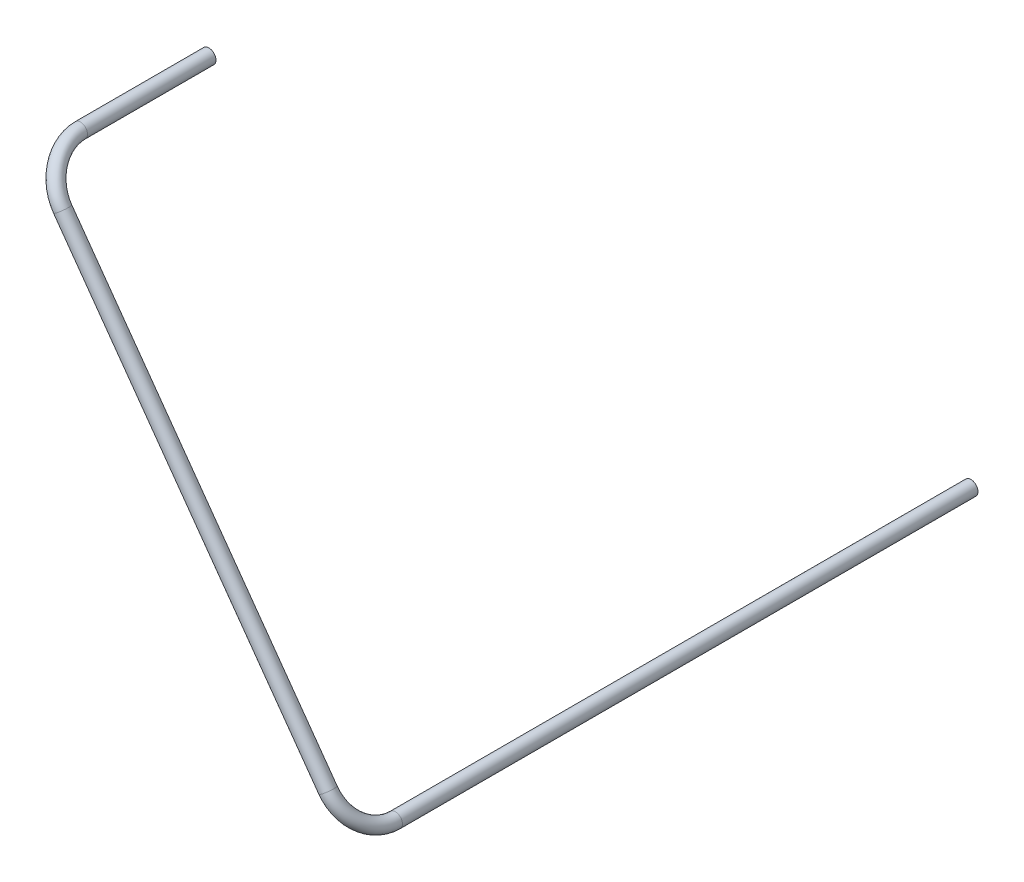
ISO-10303-21;
HEADER;
FILE_DESCRIPTION(('STEP AP214'),'2;1');
FILE_NAME('part.step','',(''),(''),'','','');
FILE_SCHEMA(('AUTOMOTIVE_DESIGN { 1 0 10303 214 1 1 1 1 }'));
ENDSEC;
DATA;
#1=APPLICATION_CONTEXT('core data for automotive mechanical design processes');
#2=APPLICATION_PROTOCOL_DEFINITION('international standard','automotive_design',2000,#1);
#3=PRODUCT_CONTEXT('',#1,'mechanical');
#4=PRODUCT('Part','Part','',(#3));
#5=PRODUCT_RELATED_PRODUCT_CATEGORY('part','',(#4));
#6=PRODUCT_DEFINITION_FORMATION('','',#4);
#7=PRODUCT_DEFINITION_CONTEXT('part definition',#1,'design');
#8=PRODUCT_DEFINITION('design','',#6,#7);
#9=PRODUCT_DEFINITION_SHAPE('','',#8);
#10=(LENGTH_UNIT() NAMED_UNIT(*) SI_UNIT(.MILLI.,.METRE.));
#11=(NAMED_UNIT(*) PLANE_ANGLE_UNIT() SI_UNIT($,.RADIAN.));
#12=(NAMED_UNIT(*) SI_UNIT($,.STERADIAN.) SOLID_ANGLE_UNIT());
#13=UNCERTAINTY_MEASURE_WITH_UNIT(LENGTH_MEASURE(1.E-05),#10,'distance_accuracy_value','');
#14=(GEOMETRIC_REPRESENTATION_CONTEXT(3) GLOBAL_UNCERTAINTY_ASSIGNED_CONTEXT((#13)) GLOBAL_UNIT_ASSIGNED_CONTEXT((#10,
#11,#12)) REPRESENTATION_CONTEXT('',''));
#15=CARTESIAN_POINT('',(0.,0.,0.));
#16=DIRECTION('',(0.,0.,1.));
#17=DIRECTION('',(1.,0.,0.));
#18=AXIS2_PLACEMENT_3D('',#15,#16,#17);
#19=CARTESIAN_POINT('',(282.010871305788,-393.82561051938,115.002872571887));
#20=DIRECTION('',(0.,0.,-1.));
#21=DIRECTION('',(-1.,0.,0.));
#22=AXIS2_PLACEMENT_3D('',#19,#20,#21);
#23=CYLINDRICAL_SURFACE('',#22,6.35);
#24=CARTESIAN_POINT('',(282.010871305788,-393.82561051938,115.002872571887));
#25=DIRECTION('',(0.,0.,-1.));
#26=DIRECTION('',(0.322076822253796,0.946713536697822,0.));
#27=AXIS2_PLACEMENT_3D('',#24,#25,#26);
#28=CIRCLE('',#27,6.35);
#29=CARTESIAN_POINT('',(285.707867203451,-398.988431582777,115.002872571887));
#30=VERTEX_POINT('',#29);
#31=EDGE_CURVE('E37',#30,#30,#28,.T.);
#32=ORIENTED_EDGE('',*,*,#31,.T.);
#33=EDGE_LOOP('',(#32));
#34=FACE_BOUND('',#33,.T.);
#35=CARTESIAN_POINT('',(282.010871305789,-393.825610519379,-400.347253912724));
#36=DIRECTION('',(0.,0.,-1.));
#37=DIRECTION('',(0.322076822253796,0.946713536697822,0.));
#38=AXIS2_PLACEMENT_3D('',#35,#36,#37);
#39=CIRCLE('',#38,6.35);
#40=CARTESIAN_POINT('',(284.056059127101,-387.813979561348,-400.347253912724));
#41=VERTEX_POINT('',#40);
#42=EDGE_CURVE('E10',#41,#41,#39,.T.);
#43=ORIENTED_EDGE('',*,*,#42,.F.);
#44=EDGE_LOOP('',(#43));
#45=FACE_BOUND('',#44,.T.);
#46=ADVANCED_FACE('F31',(#34,#45),#23,.T.);
#47=CARTESIAN_POINT('',(259.828895919812,-362.848684138993,115.002872571887));
#48=DIRECTION('',(0.813042687149265,0.582204078372097,0.));
#49=DIRECTION('',(-0.582204078372097,0.813042687149265,0.));
#50=AXIS2_PLACEMENT_3D('',#47,#48,#49);
#51=TOROIDAL_SURFACE('',#50,38.1,6.35);
#52=CARTESIAN_POINT('',(259.828895919812,-362.848684138993,153.102872571887));
#53=DIRECTION('',(0.582204078372097,-0.813042687149264,0.));
#54=DIRECTION('',(0.661038411126897,0.473356768348913,-0.582204078372096));
#55=AXIS2_PLACEMENT_3D('',#52,#53,#54);
#56=CIRCLE('',#55,6.35);
#57=CARTESIAN_POINT('',(259.828895919812,-362.848684138993,159.452872571887));
#58=VERTEX_POINT('',#57);
#59=EDGE_CURVE('E41',#58,#58,#56,.T.);
#60=CARTESIAN_POINT('',(259.828895919812,-362.848684138993,115.002872571887));
#61=DIRECTION('',(0.813042687149265,0.582204078372097,0.));
#62=DIRECTION('',(-0.582204078372097,0.813042687149265,0.));
#63=AXIS2_PLACEMENT_3D('',#60,#61,#62);
#64=CIRCLE('',#63,44.45);
#65=EDGE_CURVE('',#58,#30,#64,.T.);
#66=ORIENTED_EDGE('',*,*,#59,.T.);
#67=ORIENTED_EDGE('',*,*,#31,.F.);
#68=ORIENTED_EDGE('',*,*,#65,.T.);
#69=ORIENTED_EDGE('',*,*,#65,.F.);
#70=EDGE_LOOP('',(#66,#68,#67,#69));
#71=FACE_BOUND('',#70,.T.);
#72=ADVANCED_FACE('F99',(#71),#51,.T.);
#73=CARTESIAN_POINT('',(22.1819753859769,-30.9769263803869,153.102872571887));
#74=DIRECTION('',(0.582204078372096,-0.813042687149265,0.));
#75=DIRECTION('',(0.813042687149265,0.582204078372096,0.));
#76=AXIS2_PLACEMENT_3D('',#73,#74,#75);
#77=CYLINDRICAL_SURFACE('',#76,6.35);
#78=CARTESIAN_POINT('',(22.1819753859769,-30.9769263803869,153.102872571887));
#79=DIRECTION('',(0.582204078372097,-0.813042687149264,0.));
#80=DIRECTION('',(0.661038411126897,0.473356768348913,-0.582204078372096));
#81=AXIS2_PLACEMENT_3D('',#78,#79,#80);
#82=CIRCLE('',#81,6.35);
#83=CARTESIAN_POINT('',(22.1819753859769,-30.9769263803869,159.452872571887));
#84=VERTEX_POINT('',#83);
#85=EDGE_CURVE('E45',#84,#84,#82,.T.);
#86=ORIENTED_EDGE('',*,*,#85,.T.);
#87=EDGE_LOOP('',(#86));
#88=FACE_BOUND('',#87,.T.);
#89=ORIENTED_EDGE('',*,*,#59,.F.);
#90=EDGE_LOOP('',(#89));
#91=FACE_BOUND('',#90,.T.);
#92=ADVANCED_FACE('F103',(#88,#91),#77,.T.);
#93=CARTESIAN_POINT('',(22.1819753859769,-30.9769263803868,115.002872571887));
#94=DIRECTION('',(0.813042687149265,0.582204078372097,0.));
#95=DIRECTION('',(-0.582204078372097,0.813042687149265,0.));
#96=AXIS2_PLACEMENT_3D('',#93,#94,#95);
#97=TOROIDAL_SURFACE('',#96,38.1,6.35);
#98=CARTESIAN_POINT('',(0.,2.22044604925031E-13,115.002872571887));
#99=DIRECTION('',(0.,0.,1.));
#100=DIRECTION('',(1.,0.,0.));
#101=AXIS2_PLACEMENT_3D('',#98,#99,#100);
#102=CIRCLE('',#101,6.35);
#103=CARTESIAN_POINT('',(-3.69699589766277,5.16282106339806,115.002872571887));
#104=VERTEX_POINT('',#103);
#105=EDGE_CURVE('E50',#104,#104,#102,.T.);
#106=CARTESIAN_POINT('',(22.1819753859769,-30.9769263803868,115.002872571887));
#107=DIRECTION('',(0.813042687149265,0.582204078372097,0.));
#108=DIRECTION('',(-0.582204078372097,0.813042687149265,0.));
#109=AXIS2_PLACEMENT_3D('',#106,#107,#108);
#110=CIRCLE('',#109,44.45);
#111=EDGE_CURVE('',#104,#84,#110,.T.);
#112=ORIENTED_EDGE('',*,*,#105,.T.);
#113=ORIENTED_EDGE('',*,*,#85,.F.);
#114=ORIENTED_EDGE('',*,*,#111,.T.);
#115=ORIENTED_EDGE('',*,*,#111,.F.);
#116=EDGE_LOOP('',(#112,#114,#113,#115));
#117=FACE_BOUND('',#116,.T.);
#118=ADVANCED_FACE('F94',(#117),#97,.T.);
#119=CARTESIAN_POINT('',(0.,2.22044604925031E-13,115.002872571887));
#120=DIRECTION('',(0.,0.,-1.));
#121=DIRECTION('',(0.,1.,0.));
#122=AXIS2_PLACEMENT_3D('',#119,#120,#121);
#123=CYLINDRICAL_SURFACE('',#122,6.35);
#124=ORIENTED_EDGE('',*,*,#105,.F.);
#125=EDGE_LOOP('',(#124));
#126=FACE_BOUND('',#125,.T.);
#127=CARTESIAN_POINT('',(0.,0.,0.));
#128=DIRECTION('',(0.,0.,1.));
#129=DIRECTION('',(1.,0.,0.));
#130=AXIS2_PLACEMENT_3D('',#127,#128,#129);
#131=CIRCLE('',#130,6.35);
#132=CARTESIAN_POINT('',(6.35,0.,0.));
#133=VERTEX_POINT('',#132);
#134=EDGE_CURVE('E51',#133,#133,#131,.T.);
#135=ORIENTED_EDGE('',*,*,#134,.T.);
#136=EDGE_LOOP('',(#135));
#137=FACE_BOUND('',#136,.T.);
#138=ADVANCED_FACE('F86',(#126,#137),#123,.T.);
#139=CARTESIAN_POINT('',(282.010871305789,-393.825610519379,-400.347253912724));
#140=DIRECTION('',(0.,0.,-1.));
#141=DIRECTION('',(0.322076822253796,0.946713536697822,0.));
#142=AXIS2_PLACEMENT_3D('',#139,#140,#141);
#143=PLANE('',#142);
#144=CARTESIAN_POINT('',(282.010871305789,-393.825610519379,-400.347253912724));
#145=DIRECTION('',(0.,0.,-1.));
#146=DIRECTION('',(-1.,0.,0.));
#147=AXIS2_PLACEMENT_3D('',#144,#145,#146);
#148=CIRCLE('',#147,5.1054);
#149=CARTESIAN_POINT('',(276.905471305789,-393.825610519379,-400.347253912724));
#150=VERTEX_POINT('',#149);
#151=EDGE_CURVE('E54',#150,#150,#148,.T.);
#152=ORIENTED_EDGE('',*,*,#151,.F.);
#153=EDGE_LOOP('',(#152));
#154=FACE_BOUND('',#153,.T.);
#155=ORIENTED_EDGE('',*,*,#42,.T.);
#156=EDGE_LOOP('',(#155));
#157=FACE_BOUND('',#156,.T.);
#158=ADVANCED_FACE('F84',(#154,#157),#143,.T.);
#159=CARTESIAN_POINT('',(0.,0.,0.));
#160=DIRECTION('',(0.,0.,1.));
#161=DIRECTION('',(1.,0.,0.));
#162=AXIS2_PLACEMENT_3D('',#159,#160,#161);
#163=PLANE('',#162);
#164=CARTESIAN_POINT('',(0.,0.,0.));
#165=DIRECTION('',(0.,0.,1.));
#166=DIRECTION('',(1.,0.,0.));
#167=AXIS2_PLACEMENT_3D('',#164,#165,#166);
#168=CIRCLE('',#167,5.1054);
#169=CARTESIAN_POINT('',(5.1054,0.,0.));
#170=VERTEX_POINT('',#169);
#171=EDGE_CURVE('E57',#170,#170,#168,.T.);
#172=ORIENTED_EDGE('',*,*,#171,.T.);
#173=EDGE_LOOP('',(#172));
#174=FACE_BOUND('',#173,.T.);
#175=ORIENTED_EDGE('',*,*,#134,.F.);
#176=EDGE_LOOP('',(#175));
#177=FACE_BOUND('',#176,.T.);
#178=ADVANCED_FACE('F80',(#174,#177),#163,.F.);
#179=CARTESIAN_POINT('',(282.010871305788,-393.82561051938,115.002872571887));
#180=DIRECTION('',(0.,0.,-1.));
#181=DIRECTION('',(-1.,0.,0.));
#182=AXIS2_PLACEMENT_3D('',#179,#180,#181);
#183=CYLINDRICAL_SURFACE('',#182,5.1054);
#184=CARTESIAN_POINT('',(282.010871305788,-393.82561051938,115.002872571887));
#185=DIRECTION('',(0.,0.,-1.));
#186=DIRECTION('',(-1.,0.,0.));
#187=AXIS2_PLACEMENT_3D('',#184,#185,#186);
#188=CIRCLE('',#187,5.1054);
#189=CARTESIAN_POINT('',(284.983256007509,-397.976518654351,115.002872571887));
#190=VERTEX_POINT('',#189);
#191=EDGE_CURVE('E63',#190,#190,#188,.T.);
#192=ORIENTED_EDGE('',*,*,#191,.F.);
#193=EDGE_LOOP('',(#192));
#194=FACE_BOUND('',#193,.T.);
#195=ORIENTED_EDGE('',*,*,#151,.T.);
#196=EDGE_LOOP('',(#195));
#197=FACE_BOUND('',#196,.T.);
#198=ADVANCED_FACE('F77',(#194,#197),#183,.F.);
#199=CARTESIAN_POINT('',(259.828895919812,-362.848684138993,115.002872571887));
#200=DIRECTION('',(0.813042687149265,0.582204078372097,0.));
#201=DIRECTION('',(-0.582204078372097,0.813042687149265,0.));
#202=AXIS2_PLACEMENT_3D('',#199,#200,#201);
#203=TOROIDAL_SURFACE('',#202,38.1,5.1054);
#204=CARTESIAN_POINT('',(259.828895919812,-362.848684138993,153.102872571887));
#205=DIRECTION('',(-0.582204078372097,0.813042687149265,0.));
#206=DIRECTION('',(-0.813042687149265,-0.582204078372096,0.));
#207=AXIS2_PLACEMENT_3D('',#204,#205,#206);
#208=CIRCLE('',#207,5.1054);
#209=CARTESIAN_POINT('',(259.828895919812,-362.848684138993,158.208272571887));
#210=VERTEX_POINT('',#209);
#211=EDGE_CURVE('E69',#210,#210,#208,.F.);
#212=CARTESIAN_POINT('',(259.828895919812,-362.848684138993,115.002872571887));
#213=DIRECTION('',(0.813042687149265,0.582204078372097,0.));
#214=DIRECTION('',(-0.582204078372097,0.813042687149265,0.));
#215=AXIS2_PLACEMENT_3D('',#212,#213,#214);
#216=CIRCLE('',#215,43.2054);
#217=EDGE_CURVE('',#210,#190,#216,.T.);
#218=ORIENTED_EDGE('',*,*,#211,.F.);
#219=ORIENTED_EDGE('',*,*,#191,.T.);
#220=ORIENTED_EDGE('',*,*,#217,.T.);
#221=ORIENTED_EDGE('',*,*,#217,.F.);
#222=EDGE_LOOP('',(#218,#220,#219,#221));
#223=FACE_BOUND('',#222,.T.);
#224=ADVANCED_FACE('F75',(#223),#203,.F.);
#225=CARTESIAN_POINT('',(22.1819753859769,-30.9769263803869,153.102872571887));
#226=DIRECTION('',(0.582204078372096,-0.813042687149265,0.));
#227=DIRECTION('',(0.813042687149265,0.582204078372096,0.));
#228=AXIS2_PLACEMENT_3D('',#225,#226,#227);
#229=CYLINDRICAL_SURFACE('',#228,5.1054);
#230=CARTESIAN_POINT('',(22.1819753859769,-30.9769263803869,153.102872571887));
#231=DIRECTION('',(0.582204078372096,-0.813042687149265,0.));
#232=DIRECTION('',(0.813042687149265,0.582204078372096,0.));
#233=AXIS2_PLACEMENT_3D('',#230,#231,#232);
#234=CIRCLE('',#233,5.1054);
#235=CARTESIAN_POINT('',(22.1819753859769,-30.9769263803869,158.208272571887));
#236=VERTEX_POINT('',#235);
#237=EDGE_CURVE('E66',#236,#236,#234,.T.);
#238=ORIENTED_EDGE('',*,*,#237,.F.);
#239=EDGE_LOOP('',(#238));
#240=FACE_BOUND('',#239,.T.);
#241=ORIENTED_EDGE('',*,*,#211,.T.);
#242=EDGE_LOOP('',(#241));
#243=FACE_BOUND('',#242,.T.);
#244=ADVANCED_FACE('F156',(#240,#243),#229,.F.);
#245=CARTESIAN_POINT('',(22.1819753859769,-30.9769263803868,115.002872571887));
#246=DIRECTION('',(0.813042687149265,0.582204078372097,0.));
#247=DIRECTION('',(-0.582204078372097,0.813042687149265,0.));
#248=AXIS2_PLACEMENT_3D('',#245,#246,#247);
#249=TOROIDAL_SURFACE('',#248,38.1,5.1054);
#250=CARTESIAN_POINT('',(0.,2.22044604925031E-13,115.002872571887));
#251=DIRECTION('',(0.,0.,-1.));
#252=DIRECTION('',(-1.,0.,0.));
#253=AXIS2_PLACEMENT_3D('',#250,#251,#252);
#254=CIRCLE('',#253,5.1054);
#255=CARTESIAN_POINT('',(-2.97238470172086,4.15090813497208,115.002872571887));
#256=VERTEX_POINT('',#255);
#257=EDGE_CURVE('E60',#256,#256,#254,.F.);
#258=CARTESIAN_POINT('',(22.1819753859769,-30.9769263803868,115.002872571887));
#259=DIRECTION('',(0.813042687149265,0.582204078372097,0.));
#260=DIRECTION('',(-0.582204078372097,0.813042687149265,0.));
#261=AXIS2_PLACEMENT_3D('',#258,#259,#260);
#262=CIRCLE('',#261,43.2054);
#263=EDGE_CURVE('',#256,#236,#262,.T.);
#264=ORIENTED_EDGE('',*,*,#257,.F.);
#265=ORIENTED_EDGE('',*,*,#237,.T.);
#266=ORIENTED_EDGE('',*,*,#263,.T.);
#267=ORIENTED_EDGE('',*,*,#263,.F.);
#268=EDGE_LOOP('',(#264,#266,#265,#267));
#269=FACE_BOUND('',#268,.T.);
#270=ADVANCED_FACE('F166',(#269),#249,.F.);
#271=CARTESIAN_POINT('',(0.,2.22044604925031E-13,115.002872571887));
#272=DIRECTION('',(0.,0.,-1.));
#273=DIRECTION('',(0.,1.,0.));
#274=AXIS2_PLACEMENT_3D('',#271,#272,#273);
#275=CYLINDRICAL_SURFACE('',#274,5.1054);
#276=ORIENTED_EDGE('',*,*,#257,.T.);
#277=EDGE_LOOP('',(#276));
#278=FACE_BOUND('',#277,.T.);
#279=ORIENTED_EDGE('',*,*,#171,.F.);
#280=EDGE_LOOP('',(#279));
#281=FACE_BOUND('',#280,.T.);
#282=ADVANCED_FACE('F176',(#278,#281),#275,.F.);
#283=CLOSED_SHELL('',(#46,#72,#92,#118,#138,#158,#178,#198,#224,#244,#270,#282));
#284=MANIFOLD_SOLID_BREP('B2',#283);
#285=ADVANCED_BREP_SHAPE_REPRESENTATION('',(#18,#284),#14);
#286=SHAPE_DEFINITION_REPRESENTATION(#9,#285);
ENDSEC;
END-ISO-10303-21;
